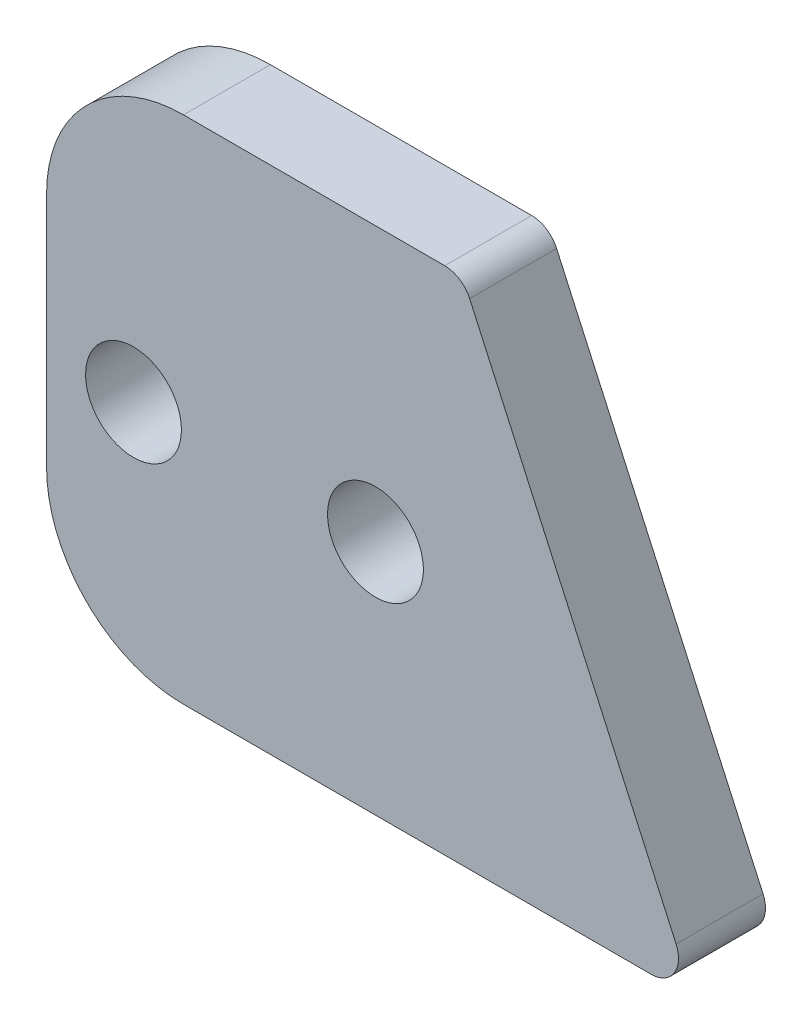
ISO-10303-21;
HEADER;
FILE_DESCRIPTION(('STEP AP214'),'2;1');
FILE_NAME('part.step','',(''),(''),'','','');
FILE_SCHEMA(('AUTOMOTIVE_DESIGN { 1 0 10303 214 1 1 1 1 }'));
ENDSEC;
DATA;
#1=APPLICATION_CONTEXT('core data for automotive mechanical design processes');
#2=APPLICATION_PROTOCOL_DEFINITION('international standard','automotive_design',2000,#1);
#3=PRODUCT_CONTEXT('',#1,'mechanical');
#4=PRODUCT('Part','Part','',(#3));
#5=PRODUCT_RELATED_PRODUCT_CATEGORY('part','',(#4));
#6=PRODUCT_DEFINITION_FORMATION('','',#4);
#7=PRODUCT_DEFINITION_CONTEXT('part definition',#1,'design');
#8=PRODUCT_DEFINITION('design','',#6,#7);
#9=PRODUCT_DEFINITION_SHAPE('','',#8);
#10=(LENGTH_UNIT() NAMED_UNIT(*) SI_UNIT(.MILLI.,.METRE.));
#11=(NAMED_UNIT(*) PLANE_ANGLE_UNIT() SI_UNIT($,.RADIAN.));
#12=(NAMED_UNIT(*) SI_UNIT($,.STERADIAN.) SOLID_ANGLE_UNIT());
#13=UNCERTAINTY_MEASURE_WITH_UNIT(LENGTH_MEASURE(1.E-05),#10,'distance_accuracy_value','');
#14=(GEOMETRIC_REPRESENTATION_CONTEXT(3) GLOBAL_UNCERTAINTY_ASSIGNED_CONTEXT((#13)) GLOBAL_UNIT_ASSIGNED_CONTEXT((#10,
#11,#12)) REPRESENTATION_CONTEXT('',''));
#15=CARTESIAN_POINT('',(0.,0.,0.));
#16=DIRECTION('',(0.,0.,1.));
#17=DIRECTION('',(1.,0.,0.));
#18=AXIS2_PLACEMENT_3D('',#15,#16,#17);
#19=CARTESIAN_POINT('',(-11.81540086,-9.32089354,1.5875));
#20=DIRECTION('',(0.,1.,0.));
#21=DIRECTION('',(0.,0.,1.));
#22=AXIS2_PLACEMENT_3D('',#19,#20,#21);
#23=PLANE('',#22);
#24=DIRECTION('',(1.,0.,0.));
#25=VECTOR('',#24,1.);
#26=CARTESIAN_POINT('',(-11.81540086,-9.32089354,1.5875));
#27=LINE('',#26,#25);
#28=CARTESIAN_POINT('',(-6.81540086,-9.32089354,1.5875));
#29=VERTEX_POINT('',#28);
#30=CARTESIAN_POINT('',(10.2645569485744,-9.32089354,1.5875));
#31=VERTEX_POINT('',#30);
#32=EDGE_CURVE('E144',#29,#31,#27,.T.);
#33=ORIENTED_EDGE('',*,*,#32,.F.);
#34=DIRECTION('',(0.,0.,-1.));
#35=VECTOR('',#34,1.);
#36=CARTESIAN_POINT('',(-6.81540086,-9.32089354,1.5875));
#37=LINE('',#36,#35);
#38=CARTESIAN_POINT('',(-6.81540086,-9.32089354,-1.5875));
#39=VERTEX_POINT('',#38);
#40=EDGE_CURVE('E11',#29,#39,#37,.T.);
#41=ORIENTED_EDGE('',*,*,#40,.T.);
#42=DIRECTION('',(1.,0.,0.));
#43=VECTOR('',#42,1.);
#44=CARTESIAN_POINT('',(-11.81540086,-9.32089354,-1.5875));
#45=LINE('',#44,#43);
#46=CARTESIAN_POINT('',(10.2645569485744,-9.32089354,-1.5875));
#47=VERTEX_POINT('',#46);
#48=EDGE_CURVE('E134',#39,#47,#45,.T.);
#49=ORIENTED_EDGE('',*,*,#48,.T.);
#50=DIRECTION('',(0.,0.,-1.));
#51=VECTOR('',#50,1.);
#52=CARTESIAN_POINT('',(10.2645569485744,-9.32089354,1.5875));
#53=LINE('',#52,#51);
#54=EDGE_CURVE('E114',#47,#31,#53,.F.);
#55=ORIENTED_EDGE('',*,*,#54,.T.);
#56=EDGE_LOOP('',(#33,#41,#49,#55));
#57=FACE_BOUND('',#56,.T.);
#58=ADVANCED_FACE('F39',(#57),#23,.F.);
#59=CARTESIAN_POINT('',(11.81540086,-9.32089354,1.5875));
#60=DIRECTION('',(-0.910890278006448,-0.412648641623035,0.));
#61=DIRECTION('',(0.412648641623035,-0.910890278006448,0.));
#62=AXIS2_PLACEMENT_3D('',#59,#60,#61);
#63=PLANE('',#62);
#64=DIRECTION('',(-0.412648641623035,0.910890278006448,0.));
#65=VECTOR('',#64,1.);
#66=CARTESIAN_POINT('',(11.81540086,-9.32089354,1.5875));
#67=LINE('',#66,#65);
#68=CARTESIAN_POINT('',(11.1754472265809,-7.90824489837696,1.5875));
#69=VERTEX_POINT('',#68);
#70=CARTESIAN_POINT('',(3.63643731665938,8.73354218162303,1.5875));
#71=VERTEX_POINT('',#70);
#72=EDGE_CURVE('E127',#69,#71,#67,.T.);
#73=ORIENTED_EDGE('',*,*,#72,.F.);
#74=DIRECTION('',(0.,0.,-1.));
#75=VECTOR('',#74,1.);
#76=CARTESIAN_POINT('',(11.1754472265809,-7.90824489837696,1.5875));
#77=LINE('',#76,#75);
#78=CARTESIAN_POINT('',(11.1754472265809,-7.90824489837696,-1.5875));
#79=VERTEX_POINT('',#78);
#80=EDGE_CURVE('E112',#69,#79,#77,.T.);
#81=ORIENTED_EDGE('',*,*,#80,.T.);
#82=DIRECTION('',(-0.412648641623035,0.910890278006448,0.));
#83=VECTOR('',#82,1.);
#84=CARTESIAN_POINT('',(11.81540086,-9.32089354,-1.5875));
#85=LINE('',#84,#83);
#86=CARTESIAN_POINT('',(3.63643731665938,8.73354218162303,-1.5875));
#87=VERTEX_POINT('',#86);
#88=EDGE_CURVE('E124',#79,#87,#85,.T.);
#89=ORIENTED_EDGE('',*,*,#88,.T.);
#90=DIRECTION('',(0.,0.,-1.));
#91=VECTOR('',#90,1.);
#92=CARTESIAN_POINT('',(3.63643731665938,8.73354218162303,1.5875));
#93=LINE('',#92,#91);
#94=EDGE_CURVE('E128',#87,#71,#93,.F.);
#95=ORIENTED_EDGE('',*,*,#94,.T.);
#96=EDGE_LOOP('',(#73,#81,#89,#95));
#97=FACE_BOUND('',#96,.T.);
#98=ADVANCED_FACE('F123',(#97),#63,.F.);
#99=CARTESIAN_POINT('',(3.37035725625941,9.32089354,1.5875));
#100=DIRECTION('',(0.,-1.,0.));
#101=DIRECTION('',(1.,0.,0.));
#102=AXIS2_PLACEMENT_3D('',#99,#100,#101);
#103=PLANE('',#102);
#104=DIRECTION('',(-1.,0.,0.));
#105=VECTOR('',#104,1.);
#106=CARTESIAN_POINT('',(3.37035725625941,9.32089354,-1.5875));
#107=LINE('',#106,#105);
#108=CARTESIAN_POINT('',(2.72554703865293,9.32089354,-1.5875));
#109=VERTEX_POINT('',#108);
#110=CARTESIAN_POINT('',(-6.81540086,9.32089354,-1.5875));
#111=VERTEX_POINT('',#110);
#112=EDGE_CURVE('E133',#109,#111,#107,.T.);
#113=ORIENTED_EDGE('',*,*,#112,.T.);
#114=DIRECTION('',(0.,0.,-1.));
#115=VECTOR('',#114,1.);
#116=CARTESIAN_POINT('',(-6.81540086,9.32089354,1.5875));
#117=LINE('',#116,#115);
#118=CARTESIAN_POINT('',(-6.81540086,9.32089354,1.5875));
#119=VERTEX_POINT('',#118);
#120=EDGE_CURVE('E62',#111,#119,#117,.F.);
#121=ORIENTED_EDGE('',*,*,#120,.T.);
#122=DIRECTION('',(-1.,0.,0.));
#123=VECTOR('',#122,1.);
#124=CARTESIAN_POINT('',(3.37035725625941,9.32089354,1.5875));
#125=LINE('',#124,#123);
#126=CARTESIAN_POINT('',(2.72554703865293,9.32089354,1.5875));
#127=VERTEX_POINT('',#126);
#128=EDGE_CURVE('E169',#127,#119,#125,.T.);
#129=ORIENTED_EDGE('',*,*,#128,.F.);
#130=DIRECTION('',(0.,0.,-1.));
#131=VECTOR('',#130,1.);
#132=CARTESIAN_POINT('',(2.72554703865293,9.32089354,1.5875));
#133=LINE('',#132,#131);
#134=EDGE_CURVE('E153',#127,#109,#133,.T.);
#135=ORIENTED_EDGE('',*,*,#134,.T.);
#136=EDGE_LOOP('',(#113,#121,#129,#135));
#137=FACE_BOUND('',#136,.T.);
#138=ADVANCED_FACE('F176',(#137),#103,.F.);
#139=CARTESIAN_POINT('',(-11.81540086,9.32089354,1.5875));
#140=DIRECTION('',(1.,0.,0.));
#141=DIRECTION('',(0.,1.,0.));
#142=AXIS2_PLACEMENT_3D('',#139,#140,#141);
#143=PLANE('',#142);
#144=DIRECTION('',(0.,-1.,0.));
#145=VECTOR('',#144,1.);
#146=CARTESIAN_POINT('',(-11.81540086,9.32089354,1.5875));
#147=LINE('',#146,#145);
#148=CARTESIAN_POINT('',(-11.81540086,4.32089354,1.5875));
#149=VERTEX_POINT('',#148);
#150=CARTESIAN_POINT('',(-11.81540086,-4.32089354,1.5875));
#151=VERTEX_POINT('',#150);
#152=EDGE_CURVE('E145',#149,#151,#147,.T.);
#153=ORIENTED_EDGE('',*,*,#152,.F.);
#154=DIRECTION('',(0.,0.,-1.));
#155=VECTOR('',#154,1.);
#156=CARTESIAN_POINT('',(-11.81540086,4.32089354,1.5875));
#157=LINE('',#156,#155);
#158=CARTESIAN_POINT('',(-11.81540086,4.32089354,-1.5875));
#159=VERTEX_POINT('',#158);
#160=EDGE_CURVE('E158',#149,#159,#157,.T.);
#161=ORIENTED_EDGE('',*,*,#160,.T.);
#162=DIRECTION('',(0.,-1.,0.));
#163=VECTOR('',#162,1.);
#164=CARTESIAN_POINT('',(-11.81540086,9.32089354,-1.5875));
#165=LINE('',#164,#163);
#166=CARTESIAN_POINT('',(-11.81540086,-4.32089354,-1.5875));
#167=VERTEX_POINT('',#166);
#168=EDGE_CURVE('E136',#159,#167,#165,.T.);
#169=ORIENTED_EDGE('',*,*,#168,.T.);
#170=DIRECTION('',(0.,0.,-1.));
#171=VECTOR('',#170,1.);
#172=CARTESIAN_POINT('',(-11.81540086,-4.32089354,1.5875));
#173=LINE('',#172,#171);
#174=EDGE_CURVE('E156',#167,#151,#173,.F.);
#175=ORIENTED_EDGE('',*,*,#174,.T.);
#176=EDGE_LOOP('',(#153,#161,#169,#175));
#177=FACE_BOUND('',#176,.T.);
#178=ADVANCED_FACE('F173',(#177),#143,.F.);
#179=CARTESIAN_POINT('',(0.,0.,1.5875));
#180=DIRECTION('',(0.,0.,-1.));
#181=DIRECTION('',(-1.,0.,0.));
#182=AXIS2_PLACEMENT_3D('',#179,#180,#181);
#183=PLANE('',#182);
#184=CARTESIAN_POINT('',(0.195357253769379,-0.67910646,1.5875));
#185=DIRECTION('',(0.,0.,-1.));
#186=DIRECTION('',(-1.,0.,0.));
#187=AXIS2_PLACEMENT_3D('',#184,#185,#186);
#188=CIRCLE('',#187,1.75);
#189=CARTESIAN_POINT('',(-1.55464274623062,-0.67910646,1.5875));
#190=VERTEX_POINT('',#189);
#191=EDGE_CURVE('E138',#190,#190,#188,.T.);
#192=ORIENTED_EDGE('',*,*,#191,.T.);
#193=EDGE_LOOP('',(#192));
#194=FACE_BOUND('',#193,.T.);
#195=CARTESIAN_POINT('',(-8.64040085750996,-0.67910646,1.5875));
#196=DIRECTION('',(0.,0.,-1.));
#197=DIRECTION('',(-1.,0.,0.));
#198=AXIS2_PLACEMENT_3D('',#195,#196,#197);
#199=CIRCLE('',#198,1.75);
#200=CARTESIAN_POINT('',(-10.39040085751,-0.67910646,1.5875));
#201=VERTEX_POINT('',#200);
#202=EDGE_CURVE('E187',#201,#201,#199,.T.);
#203=ORIENTED_EDGE('',*,*,#202,.T.);
#204=EDGE_LOOP('',(#203));
#205=FACE_BOUND('',#204,.T.);
#206=ORIENTED_EDGE('',*,*,#128,.T.);
#207=CARTESIAN_POINT('',(-6.81540086,4.32089354,1.5875));
#208=DIRECTION('',(0.,0.,-1.));
#209=DIRECTION('',(-1.,0.,0.));
#210=AXIS2_PLACEMENT_3D('',#207,#208,#209);
#211=CIRCLE('',#210,5.);
#212=EDGE_CURVE('E47',#119,#149,#211,.F.);
#213=ORIENTED_EDGE('',*,*,#212,.T.);
#214=ORIENTED_EDGE('',*,*,#152,.T.);
#215=CARTESIAN_POINT('',(-6.81540086,-4.32089354,1.5875));
#216=DIRECTION('',(0.,0.,-1.));
#217=DIRECTION('',(-1.,0.,0.));
#218=AXIS2_PLACEMENT_3D('',#215,#216,#217);
#219=CIRCLE('',#218,5.);
#220=EDGE_CURVE('E54',#151,#29,#219,.F.);
#221=ORIENTED_EDGE('',*,*,#220,.T.);
#222=ORIENTED_EDGE('',*,*,#32,.T.);
#223=CARTESIAN_POINT('',(10.2645569485744,-8.32089353999999,1.5875));
#224=DIRECTION('',(0.,0.,-1.));
#225=DIRECTION('',(-1.,0.,0.));
#226=AXIS2_PLACEMENT_3D('',#223,#224,#225);
#227=CIRCLE('',#226,1.);
#228=EDGE_CURVE('E151',#31,#69,#227,.F.);
#229=ORIENTED_EDGE('',*,*,#228,.T.);
#230=ORIENTED_EDGE('',*,*,#72,.T.);
#231=CARTESIAN_POINT('',(2.72554703865293,8.32089353999999,1.5875));
#232=DIRECTION('',(0.,0.,-1.));
#233=DIRECTION('',(-1.,0.,0.));
#234=AXIS2_PLACEMENT_3D('',#231,#232,#233);
#235=CIRCLE('',#234,1.);
#236=EDGE_CURVE('E149',#71,#127,#235,.F.);
#237=ORIENTED_EDGE('',*,*,#236,.T.);
#238=EDGE_LOOP('',(#206,#213,#214,#221,#222,#229,#230,#237));
#239=FACE_BOUND('',#238,.T.);
#240=ADVANCED_FACE('F168',(#194,#205,#239),#183,.F.);
#241=CARTESIAN_POINT('',(0.,0.,-1.5875));
#242=DIRECTION('',(0.,0.,-1.));
#243=DIRECTION('',(-1.,0.,0.));
#244=AXIS2_PLACEMENT_3D('',#241,#242,#243);
#245=PLANE('',#244);
#246=CARTESIAN_POINT('',(0.195357253769379,-0.67910646,-1.5875));
#247=DIRECTION('',(0.,0.,1.));
#248=DIRECTION('',(-1.,0.,0.));
#249=AXIS2_PLACEMENT_3D('',#246,#247,#248);
#250=CIRCLE('',#249,1.75);
#251=CARTESIAN_POINT('',(-1.55464274623062,-0.67910646,-1.5875));
#252=VERTEX_POINT('',#251);
#253=EDGE_CURVE('E190',#252,#252,#250,.T.);
#254=ORIENTED_EDGE('',*,*,#253,.T.);
#255=EDGE_LOOP('',(#254));
#256=FACE_BOUND('',#255,.T.);
#257=CARTESIAN_POINT('',(-8.64040085750996,-0.67910646,-1.5875));
#258=DIRECTION('',(0.,0.,1.));
#259=DIRECTION('',(1.,0.,0.));
#260=AXIS2_PLACEMENT_3D('',#257,#258,#259);
#261=CIRCLE('',#260,1.75);
#262=CARTESIAN_POINT('',(-6.89040085750997,-0.67910646,-1.5875));
#263=VERTEX_POINT('',#262);
#264=EDGE_CURVE('E191',#263,#263,#261,.T.);
#265=ORIENTED_EDGE('',*,*,#264,.T.);
#266=EDGE_LOOP('',(#265));
#267=FACE_BOUND('',#266,.T.);
#268=ORIENTED_EDGE('',*,*,#168,.F.);
#269=CARTESIAN_POINT('',(-6.81540086,4.32089354,-1.5875));
#270=DIRECTION('',(0.,0.,-1.));
#271=DIRECTION('',(-1.,0.,0.));
#272=AXIS2_PLACEMENT_3D('',#269,#270,#271);
#273=CIRCLE('',#272,5.);
#274=EDGE_CURVE('E163',#159,#111,#273,.T.);
#275=ORIENTED_EDGE('',*,*,#274,.T.);
#276=ORIENTED_EDGE('',*,*,#112,.F.);
#277=CARTESIAN_POINT('',(2.72554703865293,8.32089353999999,-1.5875));
#278=DIRECTION('',(0.,0.,-1.));
#279=DIRECTION('',(-1.,0.,0.));
#280=AXIS2_PLACEMENT_3D('',#277,#278,#279);
#281=CIRCLE('',#280,1.);
#282=EDGE_CURVE('E118',#109,#87,#281,.T.);
#283=ORIENTED_EDGE('',*,*,#282,.T.);
#284=ORIENTED_EDGE('',*,*,#88,.F.);
#285=CARTESIAN_POINT('',(10.2645569485744,-8.32089353999999,-1.5875));
#286=DIRECTION('',(0.,0.,-1.));
#287=DIRECTION('',(-1.,0.,0.));
#288=AXIS2_PLACEMENT_3D('',#285,#286,#287);
#289=CIRCLE('',#288,1.);
#290=EDGE_CURVE('E108',#79,#47,#289,.T.);
#291=ORIENTED_EDGE('',*,*,#290,.T.);
#292=ORIENTED_EDGE('',*,*,#48,.F.);
#293=CARTESIAN_POINT('',(-6.81540086,-4.32089354,-1.5875));
#294=DIRECTION('',(0.,0.,-1.));
#295=DIRECTION('',(-1.,0.,0.));
#296=AXIS2_PLACEMENT_3D('',#293,#294,#295);
#297=CIRCLE('',#296,5.);
#298=EDGE_CURVE('E161',#39,#167,#297,.T.);
#299=ORIENTED_EDGE('',*,*,#298,.T.);
#300=EDGE_LOOP('',(#268,#275,#276,#283,#284,#291,#292,#299));
#301=FACE_BOUND('',#300,.T.);
#302=ADVANCED_FACE('F131',(#256,#267,#301),#245,.T.);
#303=CARTESIAN_POINT('',(-8.64040085750996,-0.67910646,-1.5875));
#304=DIRECTION('',(0.,0.,1.));
#305=DIRECTION('',(1.,0.,0.));
#306=AXIS2_PLACEMENT_3D('',#303,#304,#305);
#307=CYLINDRICAL_SURFACE('',#306,1.75);
#308=ORIENTED_EDGE('',*,*,#264,.F.);
#309=EDGE_LOOP('',(#308));
#310=FACE_BOUND('',#309,.T.);
#311=ORIENTED_EDGE('',*,*,#202,.F.);
#312=EDGE_LOOP('',(#311));
#313=FACE_BOUND('',#312,.T.);
#314=ADVANCED_FACE('F202',(#310,#313),#307,.F.);
#315=CARTESIAN_POINT('',(0.195357253769379,-0.67910646,-1.5875));
#316=DIRECTION('',(0.,0.,1.));
#317=DIRECTION('',(1.,0.,0.));
#318=AXIS2_PLACEMENT_3D('',#315,#316,#317);
#319=CYLINDRICAL_SURFACE('',#318,1.75);
#320=ORIENTED_EDGE('',*,*,#253,.F.);
#321=EDGE_LOOP('',(#320));
#322=FACE_BOUND('',#321,.T.);
#323=ORIENTED_EDGE('',*,*,#191,.F.);
#324=EDGE_LOOP('',(#323));
#325=FACE_BOUND('',#324,.T.);
#326=ADVANCED_FACE('F199',(#322,#325),#319,.F.);
#327=CARTESIAN_POINT('',(10.2645569485744,-8.32089353999999,1.5875));
#328=DIRECTION('',(0.,0.,-1.));
#329=DIRECTION('',(-1.,0.,0.));
#330=AXIS2_PLACEMENT_3D('',#327,#328,#329);
#331=CYLINDRICAL_SURFACE('',#330,1.);
#332=ORIENTED_EDGE('',*,*,#228,.F.);
#333=ORIENTED_EDGE('',*,*,#54,.F.);
#334=ORIENTED_EDGE('',*,*,#290,.F.);
#335=ORIENTED_EDGE('',*,*,#80,.F.);
#336=EDGE_LOOP('',(#332,#333,#334,#335));
#337=FACE_BOUND('',#336,.T.);
#338=ADVANCED_FACE('F111',(#337),#331,.T.);
#339=CARTESIAN_POINT('',(2.72554703865293,8.32089353999999,1.5875));
#340=DIRECTION('',(0.,0.,-1.));
#341=DIRECTION('',(-1.,0.,0.));
#342=AXIS2_PLACEMENT_3D('',#339,#340,#341);
#343=CYLINDRICAL_SURFACE('',#342,1.);
#344=ORIENTED_EDGE('',*,*,#236,.F.);
#345=ORIENTED_EDGE('',*,*,#94,.F.);
#346=ORIENTED_EDGE('',*,*,#282,.F.);
#347=ORIENTED_EDGE('',*,*,#134,.F.);
#348=EDGE_LOOP('',(#344,#345,#346,#347));
#349=FACE_BOUND('',#348,.T.);
#350=ADVANCED_FACE('F180',(#349),#343,.T.);
#351=CARTESIAN_POINT('',(-6.81540086,4.32089354,1.5875));
#352=DIRECTION('',(0.,0.,-1.));
#353=DIRECTION('',(-1.,0.,0.));
#354=AXIS2_PLACEMENT_3D('',#351,#352,#353);
#355=CYLINDRICAL_SURFACE('',#354,5.);
#356=ORIENTED_EDGE('',*,*,#212,.F.);
#357=ORIENTED_EDGE('',*,*,#120,.F.);
#358=ORIENTED_EDGE('',*,*,#274,.F.);
#359=ORIENTED_EDGE('',*,*,#160,.F.);
#360=EDGE_LOOP('',(#356,#357,#358,#359));
#361=FACE_BOUND('',#360,.T.);
#362=ADVANCED_FACE('F175',(#361),#355,.T.);
#363=CARTESIAN_POINT('',(-6.81540086,-4.32089354,1.5875));
#364=DIRECTION('',(0.,0.,-1.));
#365=DIRECTION('',(-1.,0.,0.));
#366=AXIS2_PLACEMENT_3D('',#363,#364,#365);
#367=CYLINDRICAL_SURFACE('',#366,5.);
#368=ORIENTED_EDGE('',*,*,#220,.F.);
#369=ORIENTED_EDGE('',*,*,#174,.F.);
#370=ORIENTED_EDGE('',*,*,#298,.F.);
#371=ORIENTED_EDGE('',*,*,#40,.F.);
#372=EDGE_LOOP('',(#368,#369,#370,#371));
#373=FACE_BOUND('',#372,.T.);
#374=ADVANCED_FACE('F41',(#373),#367,.T.);
#375=CLOSED_SHELL('',(#58,#98,#138,#178,#240,#302,#314,#326,#338,#350,#362,#374));
#376=MANIFOLD_SOLID_BREP('B2',#375);
#377=ADVANCED_BREP_SHAPE_REPRESENTATION('',(#18,#376),#14);
#378=SHAPE_DEFINITION_REPRESENTATION(#9,#377);
ENDSEC;
END-ISO-10303-21;
